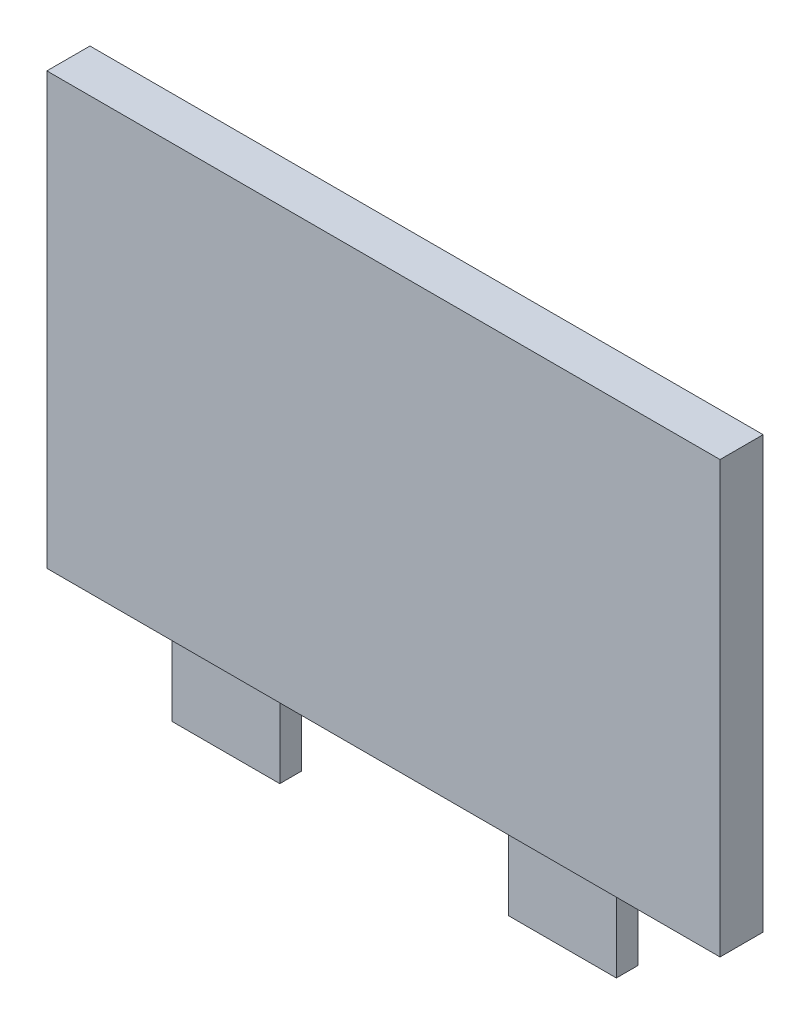
ISO-10303-21;
HEADER;
FILE_DESCRIPTION(('STEP AP214'),'2;1');
FILE_NAME('part.step','',(''),(''),'','','');
FILE_SCHEMA(('AUTOMOTIVE_DESIGN { 1 0 10303 214 1 1 1 1 }'));
ENDSEC;
DATA;
#1=APPLICATION_CONTEXT('core data for automotive mechanical design processes');
#2=APPLICATION_PROTOCOL_DEFINITION('international standard','automotive_design',2000,#1);
#3=PRODUCT_CONTEXT('',#1,'mechanical');
#4=PRODUCT('Part','Part','',(#3));
#5=PRODUCT_RELATED_PRODUCT_CATEGORY('part','',(#4));
#6=PRODUCT_DEFINITION_FORMATION('','',#4);
#7=PRODUCT_DEFINITION_CONTEXT('part definition',#1,'design');
#8=PRODUCT_DEFINITION('design','',#6,#7);
#9=PRODUCT_DEFINITION_SHAPE('','',#8);
#10=(LENGTH_UNIT() NAMED_UNIT(*) SI_UNIT(.MILLI.,.METRE.));
#11=(NAMED_UNIT(*) PLANE_ANGLE_UNIT() SI_UNIT($,.RADIAN.));
#12=(NAMED_UNIT(*) SI_UNIT($,.STERADIAN.) SOLID_ANGLE_UNIT());
#13=UNCERTAINTY_MEASURE_WITH_UNIT(LENGTH_MEASURE(1.E-05),#10,'distance_accuracy_value','');
#14=(GEOMETRIC_REPRESENTATION_CONTEXT(3) GLOBAL_UNCERTAINTY_ASSIGNED_CONTEXT((#13)) GLOBAL_UNIT_ASSIGNED_CONTEXT((#10,
#11,#12)) REPRESENTATION_CONTEXT('',''));
#15=CARTESIAN_POINT('',(0.,0.,0.));
#16=DIRECTION('',(0.,0.,1.));
#17=DIRECTION('',(1.,0.,0.));
#18=AXIS2_PLACEMENT_3D('',#15,#16,#17);
#19=CARTESIAN_POINT('',(0.,0.,0.));
#20=DIRECTION('',(0.,-1.,0.));
#21=DIRECTION('',(0.,0.,-1.));
#22=AXIS2_PLACEMENT_3D('',#19,#20,#21);
#23=PLANE('',#22);
#24=DIRECTION('',(0.,0.,1.));
#25=VECTOR('',#24,1.);
#26=CARTESIAN_POINT('',(0.,0.,0.));
#27=LINE('',#26,#25);
#28=CARTESIAN_POINT('',(0.,0.,-8.));
#29=VERTEX_POINT('',#28);
#30=CARTESIAN_POINT('',(0.,0.,0.));
#31=VERTEX_POINT('',#30);
#32=EDGE_CURVE('E179',#29,#31,#27,.T.);
#33=ORIENTED_EDGE('',*,*,#32,.F.);
#34=DIRECTION('',(-1.,0.,0.));
#35=VECTOR('',#34,1.);
#36=CARTESIAN_POINT('',(0.,0.,-8.));
#37=LINE('',#36,#35);
#38=CARTESIAN_POINT('',(125.,0.,-8.));
#39=VERTEX_POINT('',#38);
#40=EDGE_CURVE('E184',#39,#29,#37,.T.);
#41=ORIENTED_EDGE('',*,*,#40,.F.);
#42=DIRECTION('',(0.,0.,-1.));
#43=VECTOR('',#42,1.);
#44=CARTESIAN_POINT('',(125.,0.,0.));
#45=LINE('',#44,#43);
#46=CARTESIAN_POINT('',(125.,0.,0.));
#47=VERTEX_POINT('',#46);
#48=EDGE_CURVE('E195',#47,#39,#45,.T.);
#49=ORIENTED_EDGE('',*,*,#48,.F.);
#50=DIRECTION('',(1.,0.,0.));
#51=VECTOR('',#50,1.);
#52=CARTESIAN_POINT('',(0.,0.,0.));
#53=LINE('',#52,#51);
#54=EDGE_CURVE('E193',#31,#47,#53,.T.);
#55=ORIENTED_EDGE('',*,*,#54,.F.);
#56=EDGE_LOOP('',(#33,#41,#49,#55));
#57=FACE_BOUND('',#56,.T.);
#58=DIRECTION('',(-1.,0.,0.));
#59=VECTOR('',#58,1.);
#60=CARTESIAN_POINT('',(21.25,0.,-2.));
#61=LINE('',#60,#59);
#62=CARTESIAN_POINT('',(41.25,0.,-2.));
#63=VERTEX_POINT('',#62);
#64=CARTESIAN_POINT('',(21.25,0.,-2.));
#65=VERTEX_POINT('',#64);
#66=EDGE_CURVE('E151',#63,#65,#61,.T.);
#67=ORIENTED_EDGE('',*,*,#66,.F.);
#68=DIRECTION('',(0.,0.,1.));
#69=VECTOR('',#68,1.);
#70=CARTESIAN_POINT('',(41.25,0.,-2.));
#71=LINE('',#70,#69);
#72=CARTESIAN_POINT('',(41.25,0.,-6.));
#73=VERTEX_POINT('',#72);
#74=EDGE_CURVE('E148',#73,#63,#71,.T.);
#75=ORIENTED_EDGE('',*,*,#74,.F.);
#76=DIRECTION('',(1.,0.,0.));
#77=VECTOR('',#76,1.);
#78=CARTESIAN_POINT('',(21.25,0.,-6.));
#79=LINE('',#78,#77);
#80=CARTESIAN_POINT('',(21.25,0.,-6.));
#81=VERTEX_POINT('',#80);
#82=EDGE_CURVE('E160',#81,#73,#79,.T.);
#83=ORIENTED_EDGE('',*,*,#82,.F.);
#84=DIRECTION('',(0.,0.,-1.));
#85=VECTOR('',#84,1.);
#86=CARTESIAN_POINT('',(21.25,0.,-2.));
#87=LINE('',#86,#85);
#88=EDGE_CURVE('E168',#65,#81,#87,.T.);
#89=ORIENTED_EDGE('',*,*,#88,.F.);
#90=EDGE_LOOP('',(#67,#75,#83,#89));
#91=FACE_BOUND('',#90,.T.);
#92=DIRECTION('',(-1.,0.,0.));
#93=VECTOR('',#92,1.);
#94=CARTESIAN_POINT('',(83.75,0.,-2.00000000000001));
#95=LINE('',#94,#93);
#96=CARTESIAN_POINT('',(103.75,0.,-2.00000000000001));
#97=VERTEX_POINT('',#96);
#98=CARTESIAN_POINT('',(83.75,0.,-2.00000000000001));
#99=VERTEX_POINT('',#98);
#100=EDGE_CURVE('E369',#97,#99,#95,.T.);
#101=ORIENTED_EDGE('',*,*,#100,.F.);
#102=DIRECTION('',(0.,0.,1.));
#103=VECTOR('',#102,1.);
#104=CARTESIAN_POINT('',(103.75,0.,-2.00000000000001));
#105=LINE('',#104,#103);
#106=CARTESIAN_POINT('',(103.75,0.,-6.));
#107=VERTEX_POINT('',#106);
#108=EDGE_CURVE('E146',#107,#97,#105,.T.);
#109=ORIENTED_EDGE('',*,*,#108,.F.);
#110=DIRECTION('',(1.,0.,0.));
#111=VECTOR('',#110,1.);
#112=CARTESIAN_POINT('',(83.75,0.,-6.));
#113=LINE('',#112,#111);
#114=CARTESIAN_POINT('',(83.75,0.,-6.));
#115=VERTEX_POINT('',#114);
#116=EDGE_CURVE('E142',#115,#107,#113,.T.);
#117=ORIENTED_EDGE('',*,*,#116,.F.);
#118=DIRECTION('',(0.,0.,-1.));
#119=VECTOR('',#118,1.);
#120=CARTESIAN_POINT('',(83.75,0.,-2.00000000000001));
#121=LINE('',#120,#119);
#122=EDGE_CURVE('E366',#99,#115,#121,.T.);
#123=ORIENTED_EDGE('',*,*,#122,.F.);
#124=EDGE_LOOP('',(#101,#109,#117,#123));
#125=FACE_BOUND('',#124,.T.);
#126=ADVANCED_FACE('F33',(#57,#91,#125),#23,.T.);
#127=CARTESIAN_POINT('',(0.,80.,0.));
#128=DIRECTION('',(1.,0.,0.));
#129=DIRECTION('',(0.,0.,-1.));
#130=AXIS2_PLACEMENT_3D('',#127,#128,#129);
#131=PLANE('',#130);
#132=ORIENTED_EDGE('',*,*,#32,.T.);
#133=DIRECTION('',(0.,-1.,0.));
#134=VECTOR('',#133,1.);
#135=CARTESIAN_POINT('',(0.,80.,0.));
#136=LINE('',#135,#134);
#137=CARTESIAN_POINT('',(0.,80.,0.));
#138=VERTEX_POINT('',#137);
#139=EDGE_CURVE('E11',#138,#31,#136,.T.);
#140=ORIENTED_EDGE('',*,*,#139,.F.);
#141=DIRECTION('',(0.,0.,1.));
#142=VECTOR('',#141,1.);
#143=CARTESIAN_POINT('',(0.,80.,0.));
#144=LINE('',#143,#142);
#145=CARTESIAN_POINT('',(0.,80.,-8.));
#146=VERTEX_POINT('',#145);
#147=EDGE_CURVE('E180',#146,#138,#144,.T.);
#148=ORIENTED_EDGE('',*,*,#147,.F.);
#149=DIRECTION('',(0.,-1.,0.));
#150=VECTOR('',#149,1.);
#151=CARTESIAN_POINT('',(0.,80.,-8.));
#152=LINE('',#151,#150);
#153=EDGE_CURVE('E190',#146,#29,#152,.T.);
#154=ORIENTED_EDGE('',*,*,#153,.T.);
#155=EDGE_LOOP('',(#132,#140,#148,#154));
#156=FACE_BOUND('',#155,.T.);
#157=ADVANCED_FACE('F35',(#156),#131,.F.);
#158=CARTESIAN_POINT('',(0.,80.,0.));
#159=DIRECTION('',(0.,0.,-1.));
#160=DIRECTION('',(-1.,0.,0.));
#161=AXIS2_PLACEMENT_3D('',#158,#159,#160);
#162=PLANE('',#161);
#163=ORIENTED_EDGE('',*,*,#54,.T.);
#164=DIRECTION('',(0.,-1.,0.));
#165=VECTOR('',#164,1.);
#166=CARTESIAN_POINT('',(125.,80.,0.));
#167=LINE('',#166,#165);
#168=CARTESIAN_POINT('',(125.,80.,0.));
#169=VERTEX_POINT('',#168);
#170=EDGE_CURVE('E41',#169,#47,#167,.T.);
#171=ORIENTED_EDGE('',*,*,#170,.F.);
#172=DIRECTION('',(1.,0.,0.));
#173=VECTOR('',#172,1.);
#174=CARTESIAN_POINT('',(0.,80.,0.));
#175=LINE('',#174,#173);
#176=EDGE_CURVE('E183',#138,#169,#175,.T.);
#177=ORIENTED_EDGE('',*,*,#176,.F.);
#178=ORIENTED_EDGE('',*,*,#139,.T.);
#179=EDGE_LOOP('',(#163,#171,#177,#178));
#180=FACE_BOUND('',#179,.T.);
#181=ADVANCED_FACE('F223',(#180),#162,.F.);
#182=CARTESIAN_POINT('',(125.,80.,0.));
#183=DIRECTION('',(-1.,0.,0.));
#184=DIRECTION('',(0.,0.,1.));
#185=AXIS2_PLACEMENT_3D('',#182,#183,#184);
#186=PLANE('',#185);
#187=ORIENTED_EDGE('',*,*,#48,.T.);
#188=DIRECTION('',(0.,-1.,0.));
#189=VECTOR('',#188,1.);
#190=CARTESIAN_POINT('',(125.,80.,-8.));
#191=LINE('',#190,#189);
#192=CARTESIAN_POINT('',(125.,80.,-8.));
#193=VERTEX_POINT('',#192);
#194=EDGE_CURVE('E200',#193,#39,#191,.T.);
#195=ORIENTED_EDGE('',*,*,#194,.F.);
#196=DIRECTION('',(0.,0.,-1.));
#197=VECTOR('',#196,1.);
#198=CARTESIAN_POINT('',(125.,80.,0.));
#199=LINE('',#198,#197);
#200=EDGE_CURVE('E186',#169,#193,#199,.T.);
#201=ORIENTED_EDGE('',*,*,#200,.F.);
#202=ORIENTED_EDGE('',*,*,#170,.T.);
#203=EDGE_LOOP('',(#187,#195,#201,#202));
#204=FACE_BOUND('',#203,.T.);
#205=ADVANCED_FACE('F207',(#204),#186,.F.);
#206=CARTESIAN_POINT('',(0.,80.,-8.));
#207=DIRECTION('',(0.,0.,1.));
#208=DIRECTION('',(1.,0.,0.));
#209=AXIS2_PLACEMENT_3D('',#206,#207,#208);
#210=PLANE('',#209);
#211=ORIENTED_EDGE('',*,*,#40,.T.);
#212=ORIENTED_EDGE('',*,*,#153,.F.);
#213=DIRECTION('',(-1.,0.,0.));
#214=VECTOR('',#213,1.);
#215=CARTESIAN_POINT('',(0.,80.,-8.));
#216=LINE('',#215,#214);
#217=EDGE_CURVE('E188',#193,#146,#216,.T.);
#218=ORIENTED_EDGE('',*,*,#217,.F.);
#219=ORIENTED_EDGE('',*,*,#194,.T.);
#220=EDGE_LOOP('',(#211,#212,#218,#219));
#221=FACE_BOUND('',#220,.T.);
#222=ADVANCED_FACE('F216',(#221),#210,.F.);
#223=CARTESIAN_POINT('',(0.,80.,0.));
#224=DIRECTION('',(0.,-1.,0.));
#225=DIRECTION('',(0.,0.,-1.));
#226=AXIS2_PLACEMENT_3D('',#223,#224,#225);
#227=PLANE('',#226);
#228=ORIENTED_EDGE('',*,*,#147,.T.);
#229=ORIENTED_EDGE('',*,*,#176,.T.);
#230=ORIENTED_EDGE('',*,*,#200,.T.);
#231=ORIENTED_EDGE('',*,*,#217,.T.);
#232=EDGE_LOOP('',(#228,#229,#230,#231));
#233=FACE_BOUND('',#232,.T.);
#234=ADVANCED_FACE('F222',(#233),#227,.F.);
#235=CARTESIAN_POINT('',(41.25,-15.,-2.));
#236=DIRECTION('',(-1.,0.,0.));
#237=DIRECTION('',(0.,0.,1.));
#238=AXIS2_PLACEMENT_3D('',#235,#236,#237);
#239=PLANE('',#238);
#240=ORIENTED_EDGE('',*,*,#74,.T.);
#241=DIRECTION('',(0.,1.,0.));
#242=VECTOR('',#241,1.);
#243=CARTESIAN_POINT('',(41.25,-15.,-2.));
#244=LINE('',#243,#242);
#245=CARTESIAN_POINT('',(41.25,-15.,-2.));
#246=VERTEX_POINT('',#245);
#247=EDGE_CURVE('E177',#246,#63,#244,.T.);
#248=ORIENTED_EDGE('',*,*,#247,.F.);
#249=DIRECTION('',(0.,0.,1.));
#250=VECTOR('',#249,1.);
#251=CARTESIAN_POINT('',(41.25,-15.,-2.));
#252=LINE('',#251,#250);
#253=CARTESIAN_POINT('',(41.25,-15.,-6.));
#254=VERTEX_POINT('',#253);
#255=EDGE_CURVE('E156',#254,#246,#252,.T.);
#256=ORIENTED_EDGE('',*,*,#255,.F.);
#257=DIRECTION('',(0.,1.,0.));
#258=VECTOR('',#257,1.);
#259=CARTESIAN_POINT('',(41.25,-15.,-6.));
#260=LINE('',#259,#258);
#261=EDGE_CURVE('E165',#254,#73,#260,.T.);
#262=ORIENTED_EDGE('',*,*,#261,.T.);
#263=EDGE_LOOP('',(#240,#248,#256,#262));
#264=FACE_BOUND('',#263,.T.);
#265=ADVANCED_FACE('F241',(#264),#239,.F.);
#266=CARTESIAN_POINT('',(21.25,-15.,-2.));
#267=DIRECTION('',(0.,0.,-1.));
#268=DIRECTION('',(-1.,0.,0.));
#269=AXIS2_PLACEMENT_3D('',#266,#267,#268);
#270=PLANE('',#269);
#271=ORIENTED_EDGE('',*,*,#66,.T.);
#272=DIRECTION('',(0.,1.,0.));
#273=VECTOR('',#272,1.);
#274=CARTESIAN_POINT('',(21.25,-15.,-2.));
#275=LINE('',#274,#273);
#276=CARTESIAN_POINT('',(21.25,-15.,-2.));
#277=VERTEX_POINT('',#276);
#278=EDGE_CURVE('E174',#277,#65,#275,.T.);
#279=ORIENTED_EDGE('',*,*,#278,.F.);
#280=DIRECTION('',(-1.,0.,0.));
#281=VECTOR('',#280,1.);
#282=CARTESIAN_POINT('',(21.25,-15.,-2.));
#283=LINE('',#282,#281);
#284=EDGE_CURVE('E159',#246,#277,#283,.T.);
#285=ORIENTED_EDGE('',*,*,#284,.F.);
#286=ORIENTED_EDGE('',*,*,#247,.T.);
#287=EDGE_LOOP('',(#271,#279,#285,#286));
#288=FACE_BOUND('',#287,.T.);
#289=ADVANCED_FACE('F245',(#288),#270,.F.);
#290=CARTESIAN_POINT('',(21.25,-15.,-2.));
#291=DIRECTION('',(1.,0.,0.));
#292=DIRECTION('',(0.,0.,-1.));
#293=AXIS2_PLACEMENT_3D('',#290,#291,#292);
#294=PLANE('',#293);
#295=ORIENTED_EDGE('',*,*,#88,.T.);
#296=DIRECTION('',(0.,1.,0.));
#297=VECTOR('',#296,1.);
#298=CARTESIAN_POINT('',(21.25,-15.,-6.));
#299=LINE('',#298,#297);
#300=CARTESIAN_POINT('',(21.25,-15.,-6.));
#301=VERTEX_POINT('',#300);
#302=EDGE_CURVE('E56',#301,#81,#299,.T.);
#303=ORIENTED_EDGE('',*,*,#302,.F.);
#304=DIRECTION('',(0.,0.,-1.));
#305=VECTOR('',#304,1.);
#306=CARTESIAN_POINT('',(21.25,-15.,-2.));
#307=LINE('',#306,#305);
#308=EDGE_CURVE('E162',#277,#301,#307,.T.);
#309=ORIENTED_EDGE('',*,*,#308,.F.);
#310=ORIENTED_EDGE('',*,*,#278,.T.);
#311=EDGE_LOOP('',(#295,#303,#309,#310));
#312=FACE_BOUND('',#311,.T.);
#313=ADVANCED_FACE('F250',(#312),#294,.F.);
#314=CARTESIAN_POINT('',(21.25,-15.,-6.));
#315=DIRECTION('',(0.,0.,1.));
#316=DIRECTION('',(1.,0.,0.));
#317=AXIS2_PLACEMENT_3D('',#314,#315,#316);
#318=PLANE('',#317);
#319=ORIENTED_EDGE('',*,*,#82,.T.);
#320=ORIENTED_EDGE('',*,*,#261,.F.);
#321=DIRECTION('',(1.,0.,0.));
#322=VECTOR('',#321,1.);
#323=CARTESIAN_POINT('',(21.25,-15.,-6.));
#324=LINE('',#323,#322);
#325=EDGE_CURVE('E164',#301,#254,#324,.T.);
#326=ORIENTED_EDGE('',*,*,#325,.F.);
#327=ORIENTED_EDGE('',*,*,#302,.T.);
#328=EDGE_LOOP('',(#319,#320,#326,#327));
#329=FACE_BOUND('',#328,.T.);
#330=ADVANCED_FACE('F256',(#329),#318,.F.);
#331=CARTESIAN_POINT('',(0.,-15.,0.));
#332=DIRECTION('',(0.,-1.,0.));
#333=DIRECTION('',(0.,0.,-1.));
#334=AXIS2_PLACEMENT_3D('',#331,#332,#333);
#335=PLANE('',#334);
#336=ORIENTED_EDGE('',*,*,#255,.T.);
#337=ORIENTED_EDGE('',*,*,#284,.T.);
#338=ORIENTED_EDGE('',*,*,#308,.T.);
#339=ORIENTED_EDGE('',*,*,#325,.T.);
#340=EDGE_LOOP('',(#336,#337,#338,#339));
#341=FACE_BOUND('',#340,.T.);
#342=ADVANCED_FACE('F260',(#341),#335,.T.);
#343=CARTESIAN_POINT('',(103.75,-15.,-2.00000000000001));
#344=DIRECTION('',(-1.,0.,0.));
#345=DIRECTION('',(0.,0.,1.));
#346=AXIS2_PLACEMENT_3D('',#343,#344,#345);
#347=PLANE('',#346);
#348=ORIENTED_EDGE('',*,*,#108,.T.);
#349=DIRECTION('',(0.,1.,0.));
#350=VECTOR('',#349,1.);
#351=CARTESIAN_POINT('',(103.75,-15.,-2.00000000000001));
#352=LINE('',#351,#350);
#353=CARTESIAN_POINT('',(103.75,-15.,-2.00000000000001));
#354=VERTEX_POINT('',#353);
#355=EDGE_CURVE('E127',#354,#97,#352,.T.);
#356=ORIENTED_EDGE('',*,*,#355,.F.);
#357=DIRECTION('',(0.,0.,1.));
#358=VECTOR('',#357,1.);
#359=CARTESIAN_POINT('',(103.75,-15.,-2.00000000000001));
#360=LINE('',#359,#358);
#361=CARTESIAN_POINT('',(103.75,-15.,-6.));
#362=VERTEX_POINT('',#361);
#363=EDGE_CURVE('E134',#362,#354,#360,.T.);
#364=ORIENTED_EDGE('',*,*,#363,.F.);
#365=DIRECTION('',(0.,1.,0.));
#366=VECTOR('',#365,1.);
#367=CARTESIAN_POINT('',(103.75,-15.,-6.));
#368=LINE('',#367,#366);
#369=EDGE_CURVE('E363',#362,#107,#368,.T.);
#370=ORIENTED_EDGE('',*,*,#369,.T.);
#371=EDGE_LOOP('',(#348,#356,#364,#370));
#372=FACE_BOUND('',#371,.T.);
#373=ADVANCED_FACE('F144',(#372),#347,.F.);
#374=CARTESIAN_POINT('',(83.75,-15.,-2.00000000000001));
#375=DIRECTION('',(0.,0.,-1.));
#376=DIRECTION('',(-1.,0.,0.));
#377=AXIS2_PLACEMENT_3D('',#374,#375,#376);
#378=PLANE('',#377);
#379=ORIENTED_EDGE('',*,*,#100,.T.);
#380=DIRECTION('',(0.,1.,0.));
#381=VECTOR('',#380,1.);
#382=CARTESIAN_POINT('',(83.75,-15.,-2.00000000000001));
#383=LINE('',#382,#381);
#384=CARTESIAN_POINT('',(83.75,-15.,-2.00000000000001));
#385=VERTEX_POINT('',#384);
#386=EDGE_CURVE('E130',#385,#99,#383,.T.);
#387=ORIENTED_EDGE('',*,*,#386,.F.);
#388=DIRECTION('',(-1.,0.,0.));
#389=VECTOR('',#388,1.);
#390=CARTESIAN_POINT('',(83.75,-15.,-2.00000000000001));
#391=LINE('',#390,#389);
#392=EDGE_CURVE('E123',#354,#385,#391,.T.);
#393=ORIENTED_EDGE('',*,*,#392,.F.);
#394=ORIENTED_EDGE('',*,*,#355,.T.);
#395=EDGE_LOOP('',(#379,#387,#393,#394));
#396=FACE_BOUND('',#395,.T.);
#397=ADVANCED_FACE('F125',(#396),#378,.F.);
#398=CARTESIAN_POINT('',(83.75,-15.,-2.00000000000001));
#399=DIRECTION('',(1.,0.,0.));
#400=DIRECTION('',(0.,0.,-1.));
#401=AXIS2_PLACEMENT_3D('',#398,#399,#400);
#402=PLANE('',#401);
#403=ORIENTED_EDGE('',*,*,#122,.T.);
#404=DIRECTION('',(0.,1.,0.));
#405=VECTOR('',#404,1.);
#406=CARTESIAN_POINT('',(83.75,-15.,-6.));
#407=LINE('',#406,#405);
#408=CARTESIAN_POINT('',(83.75,-15.,-6.));
#409=VERTEX_POINT('',#408);
#410=EDGE_CURVE('E48',#409,#115,#407,.T.);
#411=ORIENTED_EDGE('',*,*,#410,.F.);
#412=DIRECTION('',(0.,0.,-1.));
#413=VECTOR('',#412,1.);
#414=CARTESIAN_POINT('',(83.75,-15.,-2.00000000000001));
#415=LINE('',#414,#413);
#416=EDGE_CURVE('E133',#385,#409,#415,.T.);
#417=ORIENTED_EDGE('',*,*,#416,.F.);
#418=ORIENTED_EDGE('',*,*,#386,.T.);
#419=EDGE_LOOP('',(#403,#411,#417,#418));
#420=FACE_BOUND('',#419,.T.);
#421=ADVANCED_FACE('F268',(#420),#402,.F.);
#422=CARTESIAN_POINT('',(83.75,-15.,-6.));
#423=DIRECTION('',(0.,0.,1.));
#424=DIRECTION('',(1.,0.,0.));
#425=AXIS2_PLACEMENT_3D('',#422,#423,#424);
#426=PLANE('',#425);
#427=ORIENTED_EDGE('',*,*,#116,.T.);
#428=ORIENTED_EDGE('',*,*,#369,.F.);
#429=DIRECTION('',(1.,0.,0.));
#430=VECTOR('',#429,1.);
#431=CARTESIAN_POINT('',(83.75,-15.,-6.));
#432=LINE('',#431,#430);
#433=EDGE_CURVE('E138',#409,#362,#432,.T.);
#434=ORIENTED_EDGE('',*,*,#433,.F.);
#435=ORIENTED_EDGE('',*,*,#410,.T.);
#436=EDGE_LOOP('',(#427,#428,#434,#435));
#437=FACE_BOUND('',#436,.T.);
#438=ADVANCED_FACE('F271',(#437),#426,.F.);
#439=CARTESIAN_POINT('',(0.,-15.,0.));
#440=DIRECTION('',(0.,-1.,0.));
#441=DIRECTION('',(0.,0.,-1.));
#442=AXIS2_PLACEMENT_3D('',#439,#440,#441);
#443=PLANE('',#442);
#444=ORIENTED_EDGE('',*,*,#363,.T.);
#445=ORIENTED_EDGE('',*,*,#392,.T.);
#446=ORIENTED_EDGE('',*,*,#416,.T.);
#447=ORIENTED_EDGE('',*,*,#433,.T.);
#448=EDGE_LOOP('',(#444,#445,#446,#447));
#449=FACE_BOUND('',#448,.T.);
#450=ADVANCED_FACE('F137',(#449),#443,.T.);
#451=CLOSED_SHELL('',(#126,#157,#181,#205,#222,#234,#265,#289,#313,#330,#342,#373,#397,#421,
#438,#450));
#452=MANIFOLD_SOLID_BREP('B2',#451);
#453=ADVANCED_BREP_SHAPE_REPRESENTATION('',(#18,#452),#14);
#454=SHAPE_DEFINITION_REPRESENTATION(#9,#453);
ENDSEC;
END-ISO-10303-21;
